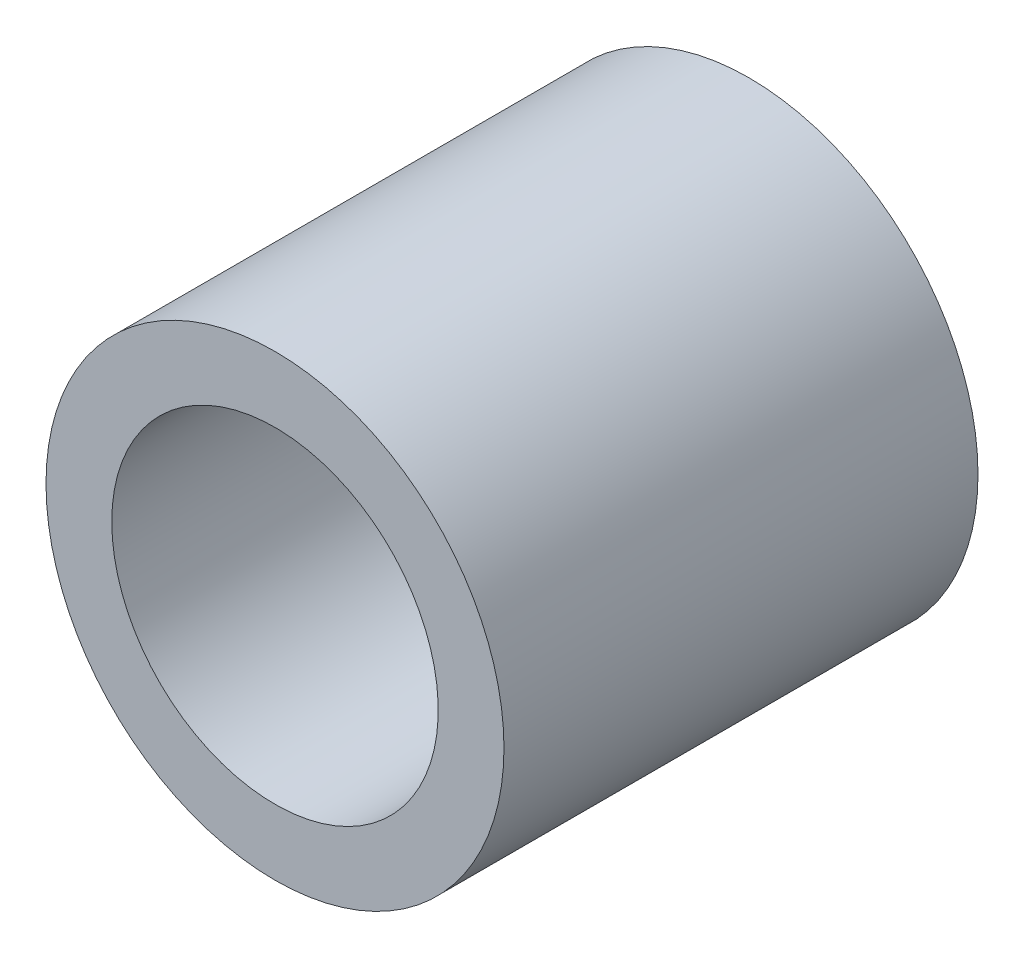
ISO-10303-21;
HEADER;
FILE_DESCRIPTION(('STEP AP214'),'2;1');
FILE_NAME('part.step','',(''),(''),'','','');
FILE_SCHEMA(('AUTOMOTIVE_DESIGN { 1 0 10303 214 1 1 1 1 }'));
ENDSEC;
DATA;
#1=APPLICATION_CONTEXT('core data for automotive mechanical design processes');
#2=APPLICATION_PROTOCOL_DEFINITION('international standard','automotive_design',2000,#1);
#3=PRODUCT_CONTEXT('',#1,'mechanical');
#4=PRODUCT('Part','Part','',(#3));
#5=PRODUCT_RELATED_PRODUCT_CATEGORY('part','',(#4));
#6=PRODUCT_DEFINITION_FORMATION('','',#4);
#7=PRODUCT_DEFINITION_CONTEXT('part definition',#1,'design');
#8=PRODUCT_DEFINITION('design','',#6,#7);
#9=PRODUCT_DEFINITION_SHAPE('','',#8);
#10=(LENGTH_UNIT() NAMED_UNIT(*) SI_UNIT(.MILLI.,.METRE.));
#11=(NAMED_UNIT(*) PLANE_ANGLE_UNIT() SI_UNIT($,.RADIAN.));
#12=(NAMED_UNIT(*) SI_UNIT($,.STERADIAN.) SOLID_ANGLE_UNIT());
#13=UNCERTAINTY_MEASURE_WITH_UNIT(LENGTH_MEASURE(1.E-05),#10,'distance_accuracy_value','');
#14=(GEOMETRIC_REPRESENTATION_CONTEXT(3) GLOBAL_UNCERTAINTY_ASSIGNED_CONTEXT((#13)) GLOBAL_UNIT_ASSIGNED_CONTEXT((#10,
#11,#12)) REPRESENTATION_CONTEXT('',''));
#15=CARTESIAN_POINT('',(0.,0.,0.));
#16=DIRECTION('',(0.,0.,1.));
#17=DIRECTION('',(1.,0.,0.));
#18=AXIS2_PLACEMENT_3D('',#15,#16,#17);
#19=CARTESIAN_POINT('',(0.,0.,0.));
#20=DIRECTION('',(0.,0.,-1.));
#21=DIRECTION('',(-1.,0.,0.));
#22=AXIS2_PLACEMENT_3D('',#19,#20,#21);
#23=CYLINDRICAL_SURFACE('',#22,47.07636);
#24=CARTESIAN_POINT('',(0.,0.,0.));
#25=DIRECTION('',(0.,0.,-1.));
#26=DIRECTION('',(-1.,0.,0.));
#27=AXIS2_PLACEMENT_3D('',#24,#25,#26);
#28=CIRCLE('',#27,47.07636);
#29=CARTESIAN_POINT('',(-47.0763599999999,0.,0.));
#30=VERTEX_POINT('',#29);
#31=EDGE_CURVE('E27',#30,#30,#28,.F.);
#32=ORIENTED_EDGE('',*,*,#31,.T.);
#33=EDGE_LOOP('',(#32));
#34=FACE_BOUND('',#33,.T.);
#35=CARTESIAN_POINT('',(0.,0.,-136.701524308712));
#36=DIRECTION('',(0.,0.,-1.));
#37=DIRECTION('',(-1.,0.,0.));
#38=AXIS2_PLACEMENT_3D('',#35,#36,#37);
#39=CIRCLE('',#38,47.07636);
#40=CARTESIAN_POINT('',(-47.07636,0.,-136.701524308712));
#41=VERTEX_POINT('',#40);
#42=EDGE_CURVE('E18',#41,#41,#39,.F.);
#43=ORIENTED_EDGE('',*,*,#42,.F.);
#44=EDGE_LOOP('',(#43));
#45=FACE_BOUND('',#44,.T.);
#46=ADVANCED_FACE('F15',(#34,#45),#23,.F.);
#47=CARTESIAN_POINT('',(0.,0.,-136.701524308712));
#48=DIRECTION('',(0.,0.,-1.));
#49=DIRECTION('',(-1.,0.,0.));
#50=AXIS2_PLACEMENT_3D('',#47,#48,#49);
#51=PLANE('',#50);
#52=CARTESIAN_POINT('',(0.,0.,-136.701524308712));
#53=DIRECTION('',(0.,0.,-1.));
#54=DIRECTION('',(-1.,0.,0.));
#55=AXIS2_PLACEMENT_3D('',#52,#53,#54);
#56=CIRCLE('',#55,66.04);
#57=CARTESIAN_POINT('',(-66.04,0.,-136.701524308712));
#58=VERTEX_POINT('',#57);
#59=EDGE_CURVE('E22',#58,#58,#56,.F.);
#60=ORIENTED_EDGE('',*,*,#59,.F.);
#61=EDGE_LOOP('',(#60));
#62=FACE_BOUND('',#61,.T.);
#63=ORIENTED_EDGE('',*,*,#42,.T.);
#64=EDGE_LOOP('',(#63));
#65=FACE_BOUND('',#64,.T.);
#66=ADVANCED_FACE('F35',(#62,#65),#51,.T.);
#67=CARTESIAN_POINT('',(0.,0.,0.));
#68=DIRECTION('',(0.,0.,-1.));
#69=DIRECTION('',(-1.,0.,0.));
#70=AXIS2_PLACEMENT_3D('',#67,#68,#69);
#71=PLANE('',#70);
#72=CARTESIAN_POINT('',(0.,0.,0.));
#73=DIRECTION('',(0.,0.,-1.));
#74=DIRECTION('',(-1.,0.,0.));
#75=AXIS2_PLACEMENT_3D('',#72,#73,#74);
#76=CIRCLE('',#75,66.04);
#77=CARTESIAN_POINT('',(-66.0399999999999,0.,0.));
#78=VERTEX_POINT('',#77);
#79=EDGE_CURVE('E10',#78,#78,#76,.T.);
#80=ORIENTED_EDGE('',*,*,#79,.F.);
#81=EDGE_LOOP('',(#80));
#82=FACE_BOUND('',#81,.T.);
#83=ORIENTED_EDGE('',*,*,#31,.F.);
#84=EDGE_LOOP('',(#83));
#85=FACE_BOUND('',#84,.T.);
#86=ADVANCED_FACE('F42',(#82,#85),#71,.F.);
#87=CARTESIAN_POINT('',(0.,0.,0.));
#88=DIRECTION('',(0.,0.,-1.));
#89=DIRECTION('',(-1.,0.,0.));
#90=AXIS2_PLACEMENT_3D('',#87,#88,#89);
#91=CYLINDRICAL_SURFACE('',#90,66.04);
#92=ORIENTED_EDGE('',*,*,#59,.T.);
#93=EDGE_LOOP('',(#92));
#94=FACE_BOUND('',#93,.T.);
#95=ORIENTED_EDGE('',*,*,#79,.T.);
#96=EDGE_LOOP('',(#95));
#97=FACE_BOUND('',#96,.T.);
#98=ADVANCED_FACE('F44',(#94,#97),#91,.T.);
#99=CLOSED_SHELL('',(#46,#66,#86,#98));
#100=MANIFOLD_SOLID_BREP('B1',#99);
#101=ADVANCED_BREP_SHAPE_REPRESENTATION('',(#18,#100),#14);
#102=SHAPE_DEFINITION_REPRESENTATION(#9,#101);
ENDSEC;
END-ISO-10303-21;
